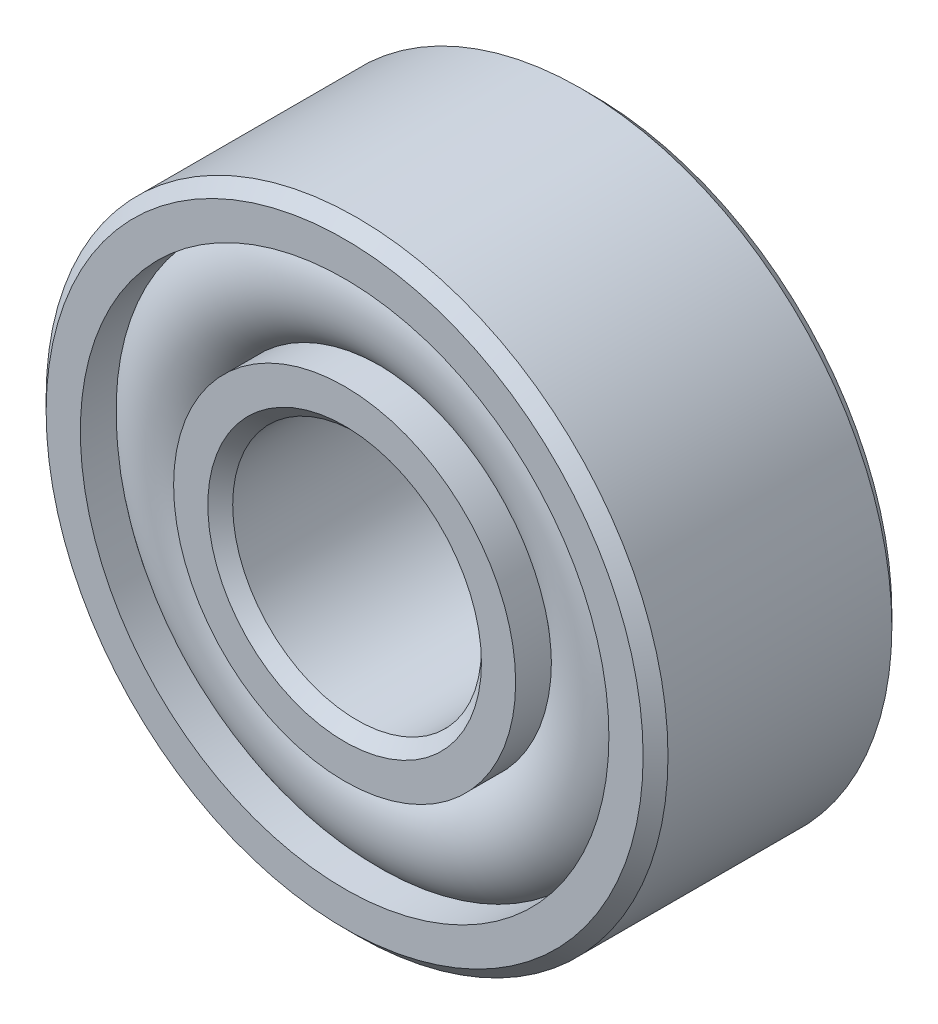
ISO-10303-21;
HEADER;
FILE_DESCRIPTION(('STEP AP214'),'2;1');
FILE_NAME('part.step','',(''),(''),'','','');
FILE_SCHEMA(('AUTOMOTIVE_DESIGN { 1 0 10303 214 1 1 1 1 }'));
ENDSEC;
DATA;
#1=APPLICATION_CONTEXT('core data for automotive mechanical design processes');
#2=APPLICATION_PROTOCOL_DEFINITION('international standard','automotive_design',2000,#1);
#3=PRODUCT_CONTEXT('',#1,'mechanical');
#4=PRODUCT('Part','Part','',(#3));
#5=PRODUCT_RELATED_PRODUCT_CATEGORY('part','',(#4));
#6=PRODUCT_DEFINITION_FORMATION('','',#4);
#7=PRODUCT_DEFINITION_CONTEXT('part definition',#1,'design');
#8=PRODUCT_DEFINITION('design','',#6,#7);
#9=PRODUCT_DEFINITION_SHAPE('','',#8);
#10=(LENGTH_UNIT() NAMED_UNIT(*) SI_UNIT(.MILLI.,.METRE.));
#11=(NAMED_UNIT(*) PLANE_ANGLE_UNIT() SI_UNIT($,.RADIAN.));
#12=(NAMED_UNIT(*) SI_UNIT($,.STERADIAN.) SOLID_ANGLE_UNIT());
#13=UNCERTAINTY_MEASURE_WITH_UNIT(LENGTH_MEASURE(1.E-05),#10,'distance_accuracy_value','');
#14=(GEOMETRIC_REPRESENTATION_CONTEXT(3) GLOBAL_UNCERTAINTY_ASSIGNED_CONTEXT((#13)) GLOBAL_UNIT_ASSIGNED_CONTEXT((#10,
#11,#12)) REPRESENTATION_CONTEXT('',''));
#15=CARTESIAN_POINT('',(0.,0.,0.));
#16=DIRECTION('',(0.,0.,1.));
#17=DIRECTION('',(1.,0.,0.));
#18=AXIS2_PLACEMENT_3D('',#15,#16,#17);
#19=CARTESIAN_POINT('',(0.,0.,-2.72254781061855));
#20=DIRECTION('',(0.,0.,1.));
#21=DIRECTION('',(1.,0.,0.));
#22=AXIS2_PLACEMENT_3D('',#19,#20,#21);
#23=TOROIDAL_SURFACE('',#22,3.5,1.02745218938145);
#24=CARTESIAN_POINT('',(0.,0.,-3.42479990314995));
#25=DIRECTION('',(0.,0.,1.));
#26=DIRECTION('',(1.,0.,0.));
#27=AXIS2_PLACEMENT_3D('',#24,#25,#26);
#28=CIRCLE('',#27,2.75);
#29=CARTESIAN_POINT('',(2.75,0.,-3.42479990314995));
#30=VERTEX_POINT('',#29);
#31=EDGE_CURVE('E66',#30,#30,#28,.T.);
#32=ORIENTED_EDGE('',*,*,#31,.T.);
#33=EDGE_LOOP('',(#32));
#34=FACE_BOUND('',#33,.T.);
#35=CARTESIAN_POINT('',(0.,0.,-3.42479990314995));
#36=DIRECTION('',(0.,0.,1.));
#37=DIRECTION('',(1.,0.,0.));
#38=AXIS2_PLACEMENT_3D('',#35,#36,#37);
#39=CIRCLE('',#38,4.25);
#40=CARTESIAN_POINT('',(4.25,0.,-3.42479990314995));
#41=VERTEX_POINT('',#40);
#42=EDGE_CURVE('E87',#41,#41,#39,.T.);
#43=ORIENTED_EDGE('',*,*,#42,.F.);
#44=EDGE_LOOP('',(#43));
#45=FACE_BOUND('',#44,.T.);
#46=ADVANCED_FACE('F34',(#34,#45),#23,.T.);
#47=CARTESIAN_POINT('',(0.,0.,-4.));
#48=DIRECTION('',(0.,0.,1.));
#49=DIRECTION('',(1.,0.,0.));
#50=AXIS2_PLACEMENT_3D('',#47,#48,#49);
#51=CYLINDRICAL_SURFACE('',#50,2.75);
#52=CARTESIAN_POINT('',(0.,0.,-4.));
#53=DIRECTION('',(0.,0.,1.));
#54=DIRECTION('',(1.,0.,0.));
#55=AXIS2_PLACEMENT_3D('',#52,#53,#54);
#56=CIRCLE('',#55,2.75);
#57=CARTESIAN_POINT('',(2.75,0.,-4.));
#58=VERTEX_POINT('',#57);
#59=EDGE_CURVE('E69',#58,#58,#56,.T.);
#60=ORIENTED_EDGE('',*,*,#59,.T.);
#61=EDGE_LOOP('',(#60));
#62=FACE_BOUND('',#61,.T.);
#63=ORIENTED_EDGE('',*,*,#31,.F.);
#64=EDGE_LOOP('',(#63));
#65=FACE_BOUND('',#64,.T.);
#66=ADVANCED_FACE('F95',(#62,#65),#51,.T.);
#67=CARTESIAN_POINT('',(2.75,0.,-4.));
#68=DIRECTION('',(0.,0.,-1.));
#69=DIRECTION('',(-1.,0.,0.));
#70=AXIS2_PLACEMENT_3D('',#67,#68,#69);
#71=PLANE('',#70);
#72=CARTESIAN_POINT('',(0.,0.,-4.));
#73=DIRECTION('',(0.,0.,-1.));
#74=DIRECTION('',(-1.,0.,0.));
#75=AXIS2_PLACEMENT_3D('',#72,#73,#74);
#76=CIRCLE('',#75,2.2);
#77=CARTESIAN_POINT('',(-2.2,0.,-4.));
#78=VERTEX_POINT('',#77);
#79=EDGE_CURVE('E57',#78,#78,#76,.F.);
#80=ORIENTED_EDGE('',*,*,#79,.T.);
#81=EDGE_LOOP('',(#80));
#82=FACE_BOUND('',#81,.T.);
#83=ORIENTED_EDGE('',*,*,#59,.F.);
#84=EDGE_LOOP('',(#83));
#85=FACE_BOUND('',#84,.T.);
#86=ADVANCED_FACE('F101',(#82,#85),#71,.T.);
#87=CARTESIAN_POINT('',(0.,0.,-4.));
#88=DIRECTION('',(0.,0.,1.));
#89=DIRECTION('',(1.,0.,0.));
#90=AXIS2_PLACEMENT_3D('',#87,#88,#89);
#91=CYLINDRICAL_SURFACE('',#90,2.);
#92=CARTESIAN_POINT('',(0.,0.,-0.199999999999993));
#93=DIRECTION('',(0.,0.,1.));
#94=DIRECTION('',(1.,0.,0.));
#95=AXIS2_PLACEMENT_3D('',#92,#93,#94);
#96=CIRCLE('',#95,2.);
#97=CARTESIAN_POINT('',(2.,0.,-0.199999999999993));
#98=VERTEX_POINT('',#97);
#99=EDGE_CURVE('E41',#98,#98,#96,.T.);
#100=ORIENTED_EDGE('',*,*,#99,.T.);
#101=EDGE_LOOP('',(#100));
#102=FACE_BOUND('',#101,.T.);
#103=CARTESIAN_POINT('',(0.,0.,-3.8));
#104=DIRECTION('',(0.,0.,-1.));
#105=DIRECTION('',(-1.,0.,0.));
#106=AXIS2_PLACEMENT_3D('',#103,#104,#105);
#107=CIRCLE('',#106,2.);
#108=CARTESIAN_POINT('',(-2.,0.,-3.8));
#109=VERTEX_POINT('',#108);
#110=EDGE_CURVE('E54',#109,#109,#107,.T.);
#111=ORIENTED_EDGE('',*,*,#110,.T.);
#112=EDGE_LOOP('',(#111));
#113=FACE_BOUND('',#112,.T.);
#114=ADVANCED_FACE('F151',(#102,#113),#91,.F.);
#115=CARTESIAN_POINT('',(2.,0.,0.));
#116=DIRECTION('',(0.,0.,1.));
#117=DIRECTION('',(1.,0.,0.));
#118=AXIS2_PLACEMENT_3D('',#115,#116,#117);
#119=PLANE('',#118);
#120=CARTESIAN_POINT('',(0.,0.,0.));
#121=DIRECTION('',(0.,0.,1.));
#122=DIRECTION('',(1.,0.,0.));
#123=AXIS2_PLACEMENT_3D('',#120,#121,#122);
#124=CIRCLE('',#123,2.2);
#125=CARTESIAN_POINT('',(2.2,0.,0.));
#126=VERTEX_POINT('',#125);
#127=EDGE_CURVE('E10',#126,#126,#124,.F.);
#128=ORIENTED_EDGE('',*,*,#127,.T.);
#129=EDGE_LOOP('',(#128));
#130=FACE_BOUND('',#129,.T.);
#131=CARTESIAN_POINT('',(0.,0.,0.));
#132=DIRECTION('',(0.,0.,1.));
#133=DIRECTION('',(1.,0.,0.));
#134=AXIS2_PLACEMENT_3D('',#131,#132,#133);
#135=CIRCLE('',#134,2.75);
#136=CARTESIAN_POINT('',(2.75,0.,0.));
#137=VERTEX_POINT('',#136);
#138=EDGE_CURVE('E72',#137,#137,#135,.T.);
#139=ORIENTED_EDGE('',*,*,#138,.T.);
#140=EDGE_LOOP('',(#139));
#141=FACE_BOUND('',#140,.T.);
#142=ADVANCED_FACE('F146',(#130,#141),#119,.T.);
#143=CARTESIAN_POINT('',(0.,0.,-4.));
#144=DIRECTION('',(0.,0.,1.));
#145=DIRECTION('',(1.,0.,0.));
#146=AXIS2_PLACEMENT_3D('',#143,#144,#145);
#147=CYLINDRICAL_SURFACE('',#146,2.75);
#148=CARTESIAN_POINT('',(0.,0.,-0.575200096850048));
#149=DIRECTION('',(0.,0.,1.));
#150=DIRECTION('',(1.,0.,0.));
#151=AXIS2_PLACEMENT_3D('',#148,#149,#150);
#152=CIRCLE('',#151,2.75);
#153=CARTESIAN_POINT('',(2.75,0.,-0.575200096850048));
#154=VERTEX_POINT('',#153);
#155=EDGE_CURVE('E75',#154,#154,#152,.T.);
#156=ORIENTED_EDGE('',*,*,#155,.T.);
#157=EDGE_LOOP('',(#156));
#158=FACE_BOUND('',#157,.T.);
#159=ORIENTED_EDGE('',*,*,#138,.F.);
#160=EDGE_LOOP('',(#159));
#161=FACE_BOUND('',#160,.T.);
#162=ADVANCED_FACE('F140',(#158,#161),#147,.T.);
#163=CARTESIAN_POINT('',(0.,0.,-1.27745218938145));
#164=DIRECTION('',(0.,0.,1.));
#165=DIRECTION('',(1.,0.,0.));
#166=AXIS2_PLACEMENT_3D('',#163,#164,#165);
#167=TOROIDAL_SURFACE('',#166,3.5,1.02745218938145);
#168=CARTESIAN_POINT('',(0.,0.,-0.575200096850048));
#169=DIRECTION('',(0.,0.,1.));
#170=DIRECTION('',(1.,0.,0.));
#171=AXIS2_PLACEMENT_3D('',#168,#169,#170);
#172=CIRCLE('',#171,4.25);
#173=CARTESIAN_POINT('',(4.25,0.,-0.575200096850048));
#174=VERTEX_POINT('',#173);
#175=EDGE_CURVE('E78',#174,#174,#172,.T.);
#176=ORIENTED_EDGE('',*,*,#175,.T.);
#177=EDGE_LOOP('',(#176));
#178=FACE_BOUND('',#177,.T.);
#179=ORIENTED_EDGE('',*,*,#155,.F.);
#180=EDGE_LOOP('',(#179));
#181=FACE_BOUND('',#180,.T.);
#182=ADVANCED_FACE('F134',(#178,#181),#167,.T.);
#183=CARTESIAN_POINT('',(0.,0.,-4.));
#184=DIRECTION('',(0.,0.,1.));
#185=DIRECTION('',(1.,0.,0.));
#186=AXIS2_PLACEMENT_3D('',#183,#184,#185);
#187=CYLINDRICAL_SURFACE('',#186,4.25);
#188=CARTESIAN_POINT('',(0.,0.,0.));
#189=DIRECTION('',(0.,0.,1.));
#190=DIRECTION('',(1.,0.,0.));
#191=AXIS2_PLACEMENT_3D('',#188,#189,#190);
#192=CIRCLE('',#191,4.25);
#193=CARTESIAN_POINT('',(4.25,0.,0.));
#194=VERTEX_POINT('',#193);
#195=EDGE_CURVE('E81',#194,#194,#192,.T.);
#196=ORIENTED_EDGE('',*,*,#195,.T.);
#197=EDGE_LOOP('',(#196));
#198=FACE_BOUND('',#197,.T.);
#199=ORIENTED_EDGE('',*,*,#175,.F.);
#200=EDGE_LOOP('',(#199));
#201=FACE_BOUND('',#200,.T.);
#202=ADVANCED_FACE('F128',(#198,#201),#187,.F.);
#203=CARTESIAN_POINT('',(4.25,0.,0.));
#204=DIRECTION('',(0.,0.,1.));
#205=DIRECTION('',(1.,0.,0.));
#206=AXIS2_PLACEMENT_3D('',#203,#204,#205);
#207=PLANE('',#206);
#208=CARTESIAN_POINT('',(0.,0.,0.));
#209=DIRECTION('',(0.,0.,1.));
#210=DIRECTION('',(1.,0.,0.));
#211=AXIS2_PLACEMENT_3D('',#208,#209,#210);
#212=CIRCLE('',#211,4.8);
#213=CARTESIAN_POINT('',(4.8,0.,0.));
#214=VERTEX_POINT('',#213);
#215=EDGE_CURVE('E49',#214,#214,#212,.T.);
#216=ORIENTED_EDGE('',*,*,#215,.T.);
#217=EDGE_LOOP('',(#216));
#218=FACE_BOUND('',#217,.T.);
#219=ORIENTED_EDGE('',*,*,#195,.F.);
#220=EDGE_LOOP('',(#219));
#221=FACE_BOUND('',#220,.T.);
#222=ADVANCED_FACE('F124',(#218,#221),#207,.T.);
#223=CARTESIAN_POINT('',(0.,0.,-4.));
#224=DIRECTION('',(0.,0.,1.));
#225=DIRECTION('',(1.,0.,0.));
#226=AXIS2_PLACEMENT_3D('',#223,#224,#225);
#227=CYLINDRICAL_SURFACE('',#226,5.);
#228=CARTESIAN_POINT('',(0.,0.,-0.199999999999995));
#229=DIRECTION('',(0.,0.,1.));
#230=DIRECTION('',(1.,0.,0.));
#231=AXIS2_PLACEMENT_3D('',#228,#229,#230);
#232=CIRCLE('',#231,5.);
#233=CARTESIAN_POINT('',(5.,0.,-0.199999999999995));
#234=VERTEX_POINT('',#233);
#235=EDGE_CURVE('E45',#234,#234,#232,.F.);
#236=ORIENTED_EDGE('',*,*,#235,.T.);
#237=EDGE_LOOP('',(#236));
#238=FACE_BOUND('',#237,.T.);
#239=CARTESIAN_POINT('',(0.,0.,-3.8));
#240=DIRECTION('',(0.,0.,-1.));
#241=DIRECTION('',(-1.,0.,0.));
#242=AXIS2_PLACEMENT_3D('',#239,#240,#241);
#243=CIRCLE('',#242,5.);
#244=CARTESIAN_POINT('',(-5.,0.,-3.8));
#245=VERTEX_POINT('',#244);
#246=EDGE_CURVE('E63',#245,#245,#243,.F.);
#247=ORIENTED_EDGE('',*,*,#246,.T.);
#248=EDGE_LOOP('',(#247));
#249=FACE_BOUND('',#248,.T.);
#250=ADVANCED_FACE('F127',(#238,#249),#227,.T.);
#251=CARTESIAN_POINT('',(5.,0.,-4.));
#252=DIRECTION('',(0.,0.,-1.));
#253=DIRECTION('',(-1.,0.,0.));
#254=AXIS2_PLACEMENT_3D('',#251,#252,#253);
#255=PLANE('',#254);
#256=CARTESIAN_POINT('',(0.,0.,-4.));
#257=DIRECTION('',(0.,0.,-1.));
#258=DIRECTION('',(-1.,0.,0.));
#259=AXIS2_PLACEMENT_3D('',#256,#257,#258);
#260=CIRCLE('',#259,4.8);
#261=CARTESIAN_POINT('',(-4.8,0.,-4.));
#262=VERTEX_POINT('',#261);
#263=EDGE_CURVE('E60',#262,#262,#260,.T.);
#264=ORIENTED_EDGE('',*,*,#263,.T.);
#265=EDGE_LOOP('',(#264));
#266=FACE_BOUND('',#265,.T.);
#267=CARTESIAN_POINT('',(0.,0.,-4.));
#268=DIRECTION('',(0.,0.,1.));
#269=DIRECTION('',(1.,0.,0.));
#270=AXIS2_PLACEMENT_3D('',#267,#268,#269);
#271=CIRCLE('',#270,4.25);
#272=CARTESIAN_POINT('',(4.25,0.,-4.));
#273=VERTEX_POINT('',#272);
#274=EDGE_CURVE('E84',#273,#273,#271,.T.);
#275=ORIENTED_EDGE('',*,*,#274,.T.);
#276=EDGE_LOOP('',(#275));
#277=FACE_BOUND('',#276,.T.);
#278=ADVANCED_FACE('F211',(#266,#277),#255,.T.);
#279=CARTESIAN_POINT('',(0.,0.,-4.));
#280=DIRECTION('',(0.,0.,1.));
#281=DIRECTION('',(1.,0.,0.));
#282=AXIS2_PLACEMENT_3D('',#279,#280,#281);
#283=CYLINDRICAL_SURFACE('',#282,4.25);
#284=ORIENTED_EDGE('',*,*,#42,.T.);
#285=EDGE_LOOP('',(#284));
#286=FACE_BOUND('',#285,.T.);
#287=ORIENTED_EDGE('',*,*,#274,.F.);
#288=EDGE_LOOP('',(#287));
#289=FACE_BOUND('',#288,.T.);
#290=ADVANCED_FACE('F91',(#286,#289),#283,.F.);
#291=CARTESIAN_POINT('',(0.,0.,-3.8));
#292=DIRECTION('',(0.,0.,1.));
#293=DIRECTION('',(1.,0.,0.));
#294=AXIS2_PLACEMENT_3D('',#291,#292,#293);
#295=CONICAL_SURFACE('',#294,5.,0.785398163397461);
#296=ORIENTED_EDGE('',*,*,#263,.F.);
#297=EDGE_LOOP('',(#296));
#298=FACE_BOUND('',#297,.T.);
#299=ORIENTED_EDGE('',*,*,#246,.F.);
#300=EDGE_LOOP('',(#299));
#301=FACE_BOUND('',#300,.T.);
#302=ADVANCED_FACE('F106',(#298,#301),#295,.T.);
#303=CARTESIAN_POINT('',(0.,0.,-4.));
#304=DIRECTION('',(0.,0.,-1.));
#305=DIRECTION('',(-1.,0.,0.));
#306=AXIS2_PLACEMENT_3D('',#303,#304,#305);
#307=CONICAL_SURFACE('',#306,2.2,0.785398163397449);
#308=ORIENTED_EDGE('',*,*,#110,.F.);
#309=EDGE_LOOP('',(#308));
#310=FACE_BOUND('',#309,.T.);
#311=ORIENTED_EDGE('',*,*,#79,.F.);
#312=EDGE_LOOP('',(#311));
#313=FACE_BOUND('',#312,.T.);
#314=ADVANCED_FACE('F109',(#310,#313),#307,.F.);
#315=CARTESIAN_POINT('',(0.,0.,0.));
#316=DIRECTION('',(0.,0.,-1.));
#317=DIRECTION('',(-1.,0.,0.));
#318=AXIS2_PLACEMENT_3D('',#315,#316,#317);
#319=CONICAL_SURFACE('',#318,4.8,0.785398163397457);
#320=ORIENTED_EDGE('',*,*,#235,.F.);
#321=EDGE_LOOP('',(#320));
#322=FACE_BOUND('',#321,.T.);
#323=ORIENTED_EDGE('',*,*,#215,.F.);
#324=EDGE_LOOP('',(#323));
#325=FACE_BOUND('',#324,.T.);
#326=ADVANCED_FACE('F112',(#322,#325),#319,.T.);
#327=CARTESIAN_POINT('',(0.,0.,-0.199999999999993));
#328=DIRECTION('',(0.,0.,1.));
#329=DIRECTION('',(1.,0.,0.));
#330=AXIS2_PLACEMENT_3D('',#327,#328,#329);
#331=CONICAL_SURFACE('',#330,2.,0.785398163397458);
#332=ORIENTED_EDGE('',*,*,#127,.F.);
#333=EDGE_LOOP('',(#332));
#334=FACE_BOUND('',#333,.T.);
#335=ORIENTED_EDGE('',*,*,#99,.F.);
#336=EDGE_LOOP('',(#335));
#337=FACE_BOUND('',#336,.T.);
#338=ADVANCED_FACE('F36',(#334,#337),#331,.F.);
#339=CLOSED_SHELL('',(#46,#66,#86,#114,#142,#162,#182,#202,#222,#250,#278,#290,#302,#314,#326,#338));
#340=MANIFOLD_SOLID_BREP('B2',#339);
#341=ADVANCED_BREP_SHAPE_REPRESENTATION('',(#18,#340),#14);
#342=SHAPE_DEFINITION_REPRESENTATION(#9,#341);
ENDSEC;
END-ISO-10303-21;
